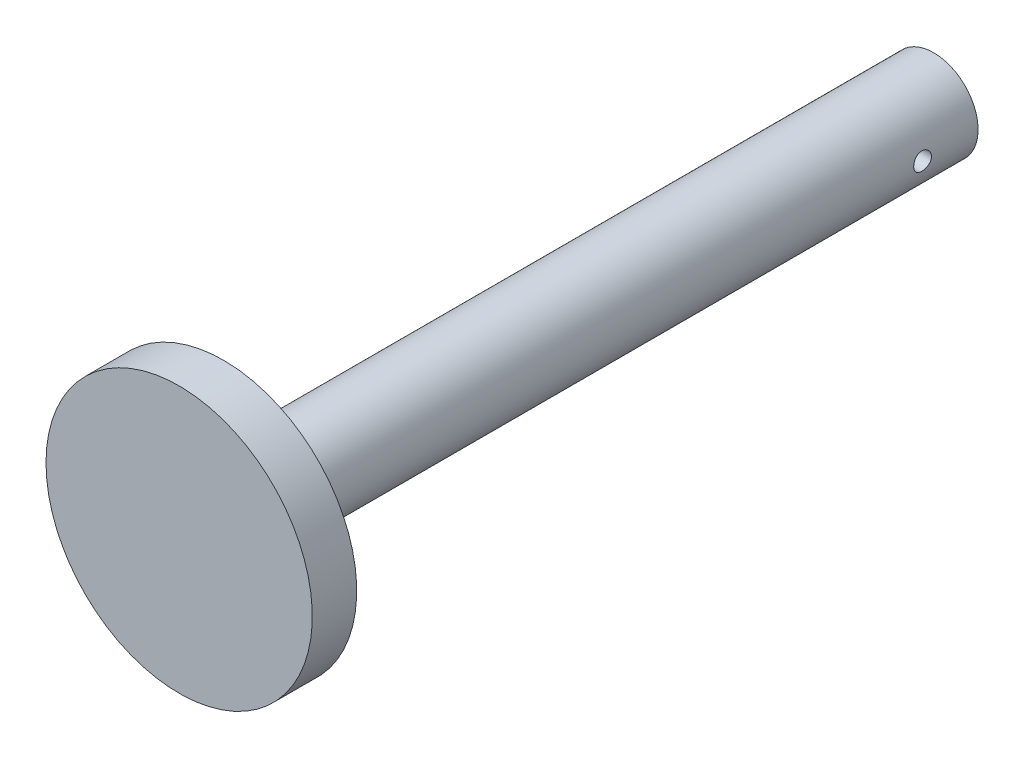
ISO-10303-21;
HEADER;
FILE_DESCRIPTION(('STEP AP214'),'2;1');
FILE_NAME('part.step','',(''),(''),'','','');
FILE_SCHEMA(('AUTOMOTIVE_DESIGN { 1 0 10303 214 1 1 1 1 }'));
ENDSEC;
DATA;
#1=APPLICATION_CONTEXT('core data for automotive mechanical design processes');
#2=APPLICATION_PROTOCOL_DEFINITION('international standard','automotive_design',2000,#1);
#3=PRODUCT_CONTEXT('',#1,'mechanical');
#4=PRODUCT('Part','Part','',(#3));
#5=PRODUCT_RELATED_PRODUCT_CATEGORY('part','',(#4));
#6=PRODUCT_DEFINITION_FORMATION('','',#4);
#7=PRODUCT_DEFINITION_CONTEXT('part definition',#1,'design');
#8=PRODUCT_DEFINITION('design','',#6,#7);
#9=PRODUCT_DEFINITION_SHAPE('','',#8);
#10=(LENGTH_UNIT() NAMED_UNIT(*) SI_UNIT(.MILLI.,.METRE.));
#11=(NAMED_UNIT(*) PLANE_ANGLE_UNIT() SI_UNIT($,.RADIAN.));
#12=(NAMED_UNIT(*) SI_UNIT($,.STERADIAN.) SOLID_ANGLE_UNIT());
#13=UNCERTAINTY_MEASURE_WITH_UNIT(LENGTH_MEASURE(1.E-05),#10,'distance_accuracy_value','');
#14=(GEOMETRIC_REPRESENTATION_CONTEXT(3) GLOBAL_UNCERTAINTY_ASSIGNED_CONTEXT((#13)) GLOBAL_UNIT_ASSIGNED_CONTEXT((#10,
#11,#12)) REPRESENTATION_CONTEXT('',''));
#15=CARTESIAN_POINT('',(0.,0.,0.));
#16=DIRECTION('',(0.,0.,1.));
#17=DIRECTION('',(1.,0.,0.));
#18=AXIS2_PLACEMENT_3D('',#15,#16,#17);
#19=CARTESIAN_POINT('',(0.,0.,0.));
#20=DIRECTION('',(0.,0.,-1.));
#21=DIRECTION('',(-1.,0.,0.));
#22=AXIS2_PLACEMENT_3D('',#19,#20,#21);
#23=PLANE('',#22);
#24=CARTESIAN_POINT('',(0.,0.,0.));
#25=DIRECTION('',(0.,0.,-1.));
#26=DIRECTION('',(-1.,0.,0.));
#27=AXIS2_PLACEMENT_3D('',#24,#25,#26);
#28=CIRCLE('',#27,15.);
#29=CARTESIAN_POINT('',(-15.,0.,0.));
#30=VERTEX_POINT('',#29);
#31=EDGE_CURVE('E10',#30,#30,#28,.T.);
#32=ORIENTED_EDGE('',*,*,#31,.F.);
#33=EDGE_LOOP('',(#32));
#34=FACE_BOUND('',#33,.T.);
#35=ADVANCED_FACE('F37',(#34),#23,.F.);
#36=CARTESIAN_POINT('',(0.,0.,-85.));
#37=DIRECTION('',(0.,0.,-1.));
#38=DIRECTION('',(-1.,0.,0.));
#39=AXIS2_PLACEMENT_3D('',#36,#37,#38);
#40=CYLINDRICAL_SURFACE('',#39,15.);
#41=CARTESIAN_POINT('',(0.,0.,-5.));
#42=DIRECTION('',(0.,0.,-1.));
#43=DIRECTION('',(-1.,0.,0.));
#44=AXIS2_PLACEMENT_3D('',#41,#42,#43);
#45=CIRCLE('',#44,15.);
#46=CARTESIAN_POINT('',(-15.,0.,-5.));
#47=VERTEX_POINT('',#46);
#48=EDGE_CURVE('E49',#47,#47,#45,.T.);
#49=ORIENTED_EDGE('',*,*,#48,.F.);
#50=EDGE_LOOP('',(#49));
#51=FACE_BOUND('',#50,.T.);
#52=ORIENTED_EDGE('',*,*,#31,.T.);
#53=EDGE_LOOP('',(#52));
#54=FACE_BOUND('',#53,.T.);
#55=ADVANCED_FACE('F82',(#51,#54),#40,.T.);
#56=CARTESIAN_POINT('',(0.,-15.,-5.));
#57=DIRECTION('',(0.,0.,1.));
#58=DIRECTION('',(1.,0.,0.));
#59=AXIS2_PLACEMENT_3D('',#56,#57,#58);
#60=PLANE('',#59);
#61=CARTESIAN_POINT('',(0.,0.,-5.));
#62=DIRECTION('',(0.,0.,-1.));
#63=DIRECTION('',(-1.,0.,0.));
#64=AXIS2_PLACEMENT_3D('',#61,#62,#63);
#65=CIRCLE('',#64,5.00000000000001);
#66=CARTESIAN_POINT('',(-5.00000000000001,0.,-5.));
#67=VERTEX_POINT('',#66);
#68=EDGE_CURVE('E54',#67,#67,#65,.T.);
#69=ORIENTED_EDGE('',*,*,#68,.F.);
#70=EDGE_LOOP('',(#69));
#71=FACE_BOUND('',#70,.T.);
#72=ORIENTED_EDGE('',*,*,#48,.T.);
#73=EDGE_LOOP('',(#72));
#74=FACE_BOUND('',#73,.T.);
#75=ADVANCED_FACE('F78',(#71,#74),#60,.F.);
#76=CARTESIAN_POINT('',(0.,0.,-85.));
#77=DIRECTION('',(0.,0.,-1.));
#78=DIRECTION('',(-1.,0.,0.));
#79=AXIS2_PLACEMENT_3D('',#76,#77,#78);
#80=CYLINDRICAL_SURFACE('',#79,5.00000000000001);
#81=CARTESIAN_POINT('',(-5.00000000000001,0.,-77.75));
#82=CARTESIAN_POINT('',(-4.99999897580872,-0.0555769067926333,-77.7500020444983));
#83=CARTESIAN_POINT('',(-4.99906385178232,-0.111179660201522,-77.7546488429677));
#84=CARTESIAN_POINT('',(-4.99542365623232,-0.220813507689019,-77.7730985001153));
#85=CARTESIAN_POINT('',(-4.99271717860187,-0.274843317541355,-77.7869086328015));
#86=CARTESIAN_POINT('',(-4.98583649278288,-0.379730305263311,-77.8232412736208));
#87=CARTESIAN_POINT('',(-4.98166369076719,-0.430590467933132,-77.8457554368447));
#88=CARTESIAN_POINT('',(-4.97230398035315,-0.527807988864222,-77.8988322475113));
#89=CARTESIAN_POINT('',(-4.96711713235708,-0.574165615075807,-77.9293944156072));
#90=CARTESIAN_POINT('',(-4.95622165329971,-0.661693477314862,-77.9981384942914));
#91=CARTESIAN_POINT('',(-4.95050745504348,-0.702793951158523,-78.0364083553912));
#92=CARTESIAN_POINT('',(-4.93924180452589,-0.778036756608029,-78.1192924163917));
#93=CARTESIAN_POINT('',(-4.93369036500425,-0.812178544770425,-78.1639071113351));
#94=CARTESIAN_POINT('',(-4.92332441812616,-0.872831753347618,-78.2587161930119));
#95=CARTESIAN_POINT('',(-4.91851707364947,-0.899270938865864,-78.3089576437963));
#96=CARTESIAN_POINT('',(-4.91026268058419,-0.943305666580306,-78.4132818190041));
#97=CARTESIAN_POINT('',(-4.90681549761963,-0.960902082437236,-78.4673641633463));
#98=CARTESIAN_POINT('',(-4.90172805252206,-0.986525299884824,-78.5770843639079));
#99=CARTESIAN_POINT('',(-4.90006470107189,-0.994674497958774,-78.6326925441422));
#100=CARTESIAN_POINT('',(-4.89866375060628,-1.00155212772612,-78.7445098213643));
#101=CARTESIAN_POINT('',(-4.89892595467842,-1.0002815227135,-78.8007188563201));
#102=CARTESIAN_POINT('',(-4.90132551148186,-0.988454573101819,-78.911246788021));
#103=CARTESIAN_POINT('',(-4.90343452858764,-0.978038540243907,-78.9655814056273));
#104=CARTESIAN_POINT('',(-4.90924546160002,-0.948437884623052,-79.071716076663));
#105=CARTESIAN_POINT('',(-4.9129474535778,-0.929252843100683,-79.123516008919));
#106=CARTESIAN_POINT('',(-4.92155618500409,-0.88252478367472,-79.2235152617036));
#107=CARTESIAN_POINT('',(-4.92647089813705,-0.854926151232111,-79.2716878795692));
#108=CARTESIAN_POINT('',(-4.93694618773063,-0.792193574572674,-79.3627708499728));
#109=CARTESIAN_POINT('',(-4.94250683838367,-0.757058764356825,-79.4056805968512));
#110=CARTESIAN_POINT('',(-4.95377021241463,-0.67949993456058,-79.4858294024569));
#111=CARTESIAN_POINT('',(-4.95947369210906,-0.636956161212439,-79.5229525678591));
#112=CARTESIAN_POINT('',(-4.97028848714409,-0.546185024062006,-79.5895538463012));
#113=CARTESIAN_POINT('',(-4.97539979488975,-0.497957587379388,-79.6190318612936));
#114=CARTESIAN_POINT('',(-4.98446690160888,-0.397059386878923,-79.669527509226));
#115=CARTESIAN_POINT('',(-4.98842088848273,-0.344381819585303,-79.6905318936445));
#116=CARTESIAN_POINT('',(-4.99471408987859,-0.236148976448668,-79.7233604740386));
#117=CARTESIAN_POINT('',(-4.99705350000532,-0.180594050072452,-79.7351857820736));
#118=CARTESIAN_POINT('',(-4.99982671866869,-0.0691794056271522,-79.7491564537943));
#119=CARTESIAN_POINT('',(-5.00029174652471,-0.0133403283255786,-79.7514604195403));
#120=CARTESIAN_POINT('',(-4.99935051930104,0.0979249341927108,-79.7467501410578));
#121=CARTESIAN_POINT('',(-4.99794436941447,0.15335114244379,-79.7397364206474));
#122=CARTESIAN_POINT('',(-4.99343832008019,0.261705659946538,-79.716721626456));
#123=CARTESIAN_POINT('',(-4.99035376404207,0.314651948339902,-79.7008019315021));
#124=CARTESIAN_POINT('',(-4.98283552061034,0.417123627499666,-79.6605160173442));
#125=CARTESIAN_POINT('',(-4.97840173214228,0.466648761637537,-79.6361491653232));
#126=CARTESIAN_POINT('',(-4.96859911533295,0.561541173686216,-79.5793175093487));
#127=CARTESIAN_POINT('',(-4.96321950437053,0.606850126752188,-79.546757218961));
#128=CARTESIAN_POINT('',(-4.95214734829883,0.691418019119205,-79.4745908087927));
#129=CARTESIAN_POINT('',(-4.94645476968389,0.730676308930757,-79.4349839336001));
#130=CARTESIAN_POINT('',(-4.93529303556966,0.802640590774168,-79.3491266481089));
#131=CARTESIAN_POINT('',(-4.92982860233305,0.835237702448649,-79.3027842557787));
#132=CARTESIAN_POINT('',(-4.91984191796195,0.892185420051201,-79.2051886386433));
#133=CARTESIAN_POINT('',(-4.91531962913344,0.9165363559229,-79.1539356104265));
#134=CARTESIAN_POINT('',(-4.90776740584384,0.956151841581957,-79.0482317538505));
#135=CARTESIAN_POINT('',(-4.90472974872188,0.971463499791047,-78.9937991587897));
#136=CARTESIAN_POINT('',(-4.90047436792026,0.992708651627194,-78.8830665465091));
#137=CARTESIAN_POINT('',(-4.89925640691112,0.99864336822511,-78.8267667737907));
#138=CARTESIAN_POINT('',(-4.8987914963138,1.00092091086747,-78.7149911354557));
#139=CARTESIAN_POINT('',(-4.89950919189302,0.997435788070894,-78.659518851073));
#140=CARTESIAN_POINT('',(-4.90275573484615,0.981352304100057,-78.549968350095));
#141=CARTESIAN_POINT('',(-4.9052845676717,0.968754016129295,-78.4958901223052));
#142=CARTESIAN_POINT('',(-4.9118526421916,0.934878568498949,-78.3907722887595));
#143=CARTESIAN_POINT('',(-4.91588821018832,0.913622506717336,-78.3397256394976));
#144=CARTESIAN_POINT('',(-4.92501714974171,0.863054644601594,-78.2418962792655));
#145=CARTESIAN_POINT('',(-4.93011060998895,0.833742168774874,-78.1951139262748));
#146=CARTESIAN_POINT('',(-4.94088960523226,0.767305914786405,-78.1062844278497));
#147=CARTESIAN_POINT('',(-4.94658372909701,0.730057887235169,-78.0643312347324));
#148=CARTESIAN_POINT('',(-4.95786081871956,0.649064369013129,-77.9872137944708));
#149=CARTESIAN_POINT('',(-4.96344375863186,0.605317387153327,-77.9520511096827));
#150=CARTESIAN_POINT('',(-4.97393832387973,0.512017629088244,-77.8891653560535));
#151=CARTESIAN_POINT('',(-4.97884231219247,0.462408884429834,-77.86152399672));
#152=CARTESIAN_POINT('',(-4.98735125085001,0.359166360940733,-77.8150138774034));
#153=CARTESIAN_POINT('',(-4.99095737138617,0.305536260863127,-77.7961372104675));
#154=CARTESIAN_POINT('',(-4.99576372595372,0.209821488923781,-77.7713480519553));
#155=CARTESIAN_POINT('',(-4.99734303158453,0.168281664013787,-77.7633568062923));
#156=CARTESIAN_POINT('',(-4.99946154139894,0.0844995252100685,-77.7526820876416));
#157=CARTESIAN_POINT('',(-5.00000077873156,0.0422572337486197,-77.7499984454902));
#158=CARTESIAN_POINT('',(-5.00000000000001,0.,-77.75));
#159=B_SPLINE_CURVE_WITH_KNOTS('',3,(#81,#82,#83,#84,#85,#86,#87,#88,#89,#90,#91,#92,#93,#94,
#95,#96,#97,#98,#99,#100,#101,#102,#103,#104,#105,#106,#107,#108,#109,#110,#111,#112,#113,#114,
#115,#116,#117,#118,#119,#120,#121,#122,#123,#124,#125,#126,#127,#128,#129,#130,#131,#132,#133,
#134,#135,#136,#137,#138,#139,#140,#141,#142,#143,#144,#145,#146,#147,#148,#149,#150,#151,#152,
#153,#154,#155,#156,#157,#158),.UNSPECIFIED.,.T.,.F.,(4,2,2,2,2,2,2,2,2,2,2,2,2,2,2,2,2,2,2,2,2,
2,2,2,2,2,2,2,2,2,2,2,2,2,2,2,2,2,4),(0.,0.16657613066126,0.333284650691321,0.499833735250335,
0.666372902230861,0.834932670112188,1.00350559674737,1.17361195005921,1.34370149365197,
1.51156185103587,1.67940504281224,1.84471727006277,2.01003739253728,2.17647490203593,
2.34293154749671,2.5123825249135,2.68183567539819,2.85155274854023,3.02124925698035,
3.18810735676264,3.35495607657866,3.52030453950722,3.68566539216022,3.85305066033358,
4.02045388345928,4.19040628579224,4.36035188723465,4.5294038103272,4.69843368330414,
4.86439722567702,5.03035943492608,5.1959196125311,5.36149367581867,5.52988076239143,
5.6983065453293,5.86849496675636,6.03852955517517,6.16518775289892,6.29184191370995),.UNSPECIFIED.);
#160=CARTESIAN_POINT('',(-5.00000000000001,0.,-77.75));
#161=VERTEX_POINT('',#160);
#162=EDGE_CURVE('E40',#161,#161,#159,.T.);
#163=ORIENTED_EDGE('',*,*,#162,.T.);
#164=EDGE_LOOP('',(#163));
#165=FACE_BOUND('',#164,.T.);
#166=CARTESIAN_POINT('',(5.00000000000001,0.,-79.75));
#167=CARTESIAN_POINT('',(4.99999897580872,-0.0555769067926332,-79.7499979555017));
#168=CARTESIAN_POINT('',(4.99906385178232,-0.111179660201522,-79.7453511570323));
#169=CARTESIAN_POINT('',(4.99542365623232,-0.220813507689019,-79.7269014998847));
#170=CARTESIAN_POINT('',(4.99271717860187,-0.274843317541356,-79.7130913671985));
#171=CARTESIAN_POINT('',(4.98583649278288,-0.379730305263316,-79.6767587263792));
#172=CARTESIAN_POINT('',(4.98166369076719,-0.430590467933139,-79.6542445631553));
#173=CARTESIAN_POINT('',(4.97230398035315,-0.527807988864228,-79.6011677524887));
#174=CARTESIAN_POINT('',(4.96711713235708,-0.57416561507581,-79.5706055843928));
#175=CARTESIAN_POINT('',(4.95622165329971,-0.661693477314859,-79.5018615057086));
#176=CARTESIAN_POINT('',(4.95050745504348,-0.70279395115852,-79.4635916446088));
#177=CARTESIAN_POINT('',(4.93924180452589,-0.778036756608026,-79.3807075836083));
#178=CARTESIAN_POINT('',(4.93369036500425,-0.812178544770423,-79.3360928886649));
#179=CARTESIAN_POINT('',(4.92332441812616,-0.872831753347618,-79.2412838069881));
#180=CARTESIAN_POINT('',(4.91851707364947,-0.899270938865864,-79.1910423562037));
#181=CARTESIAN_POINT('',(4.91026268058419,-0.943305666580306,-79.0867181809959));
#182=CARTESIAN_POINT('',(4.90681549761963,-0.960902082437236,-79.0326358366537));
#183=CARTESIAN_POINT('',(4.90172805252206,-0.986525299884824,-78.9229156360921));
#184=CARTESIAN_POINT('',(4.90006470107189,-0.994674497958774,-78.8673074558578));
#185=CARTESIAN_POINT('',(4.89866375060628,-1.00155212772612,-78.7554901786357));
#186=CARTESIAN_POINT('',(4.89892595467842,-1.0002815227135,-78.6992811436799));
#187=CARTESIAN_POINT('',(4.90132551148186,-0.988454573101819,-78.588753211979));
#188=CARTESIAN_POINT('',(4.90343452858764,-0.978038540243907,-78.5344185943727));
#189=CARTESIAN_POINT('',(4.90924546160002,-0.948437884623052,-78.428283923337));
#190=CARTESIAN_POINT('',(4.9129474535778,-0.929252843100683,-78.376483991081));
#191=CARTESIAN_POINT('',(4.92155618500409,-0.882524783674721,-78.2764847382964));
#192=CARTESIAN_POINT('',(4.92647089813705,-0.854926151232114,-78.2283121204308));
#193=CARTESIAN_POINT('',(4.93694618773063,-0.792193574572678,-78.1372291500272));
#194=CARTESIAN_POINT('',(4.94250683838367,-0.757058764356828,-78.0943194031488));
#195=CARTESIAN_POINT('',(4.95377021241463,-0.67949993456058,-78.0141705975431));
#196=CARTESIAN_POINT('',(4.95947369210906,-0.63695616121244,-77.9770474321409));
#197=CARTESIAN_POINT('',(4.97028848714409,-0.546185024062006,-77.9104461536988));
#198=CARTESIAN_POINT('',(4.97539979488975,-0.497957587379388,-77.8809681387064));
#199=CARTESIAN_POINT('',(4.98446690160888,-0.397059386878923,-77.830472490774));
#200=CARTESIAN_POINT('',(4.98842088848273,-0.344381819585303,-77.8094681063555));
#201=CARTESIAN_POINT('',(4.99471408987859,-0.236148976448668,-77.7766395259614));
#202=CARTESIAN_POINT('',(4.99705350000532,-0.180594050072452,-77.7648142179264));
#203=CARTESIAN_POINT('',(4.99982671866869,-0.0691794056271522,-77.7508435462057));
#204=CARTESIAN_POINT('',(5.00029174652471,-0.0133403283255786,-77.7485395804597));
#205=CARTESIAN_POINT('',(4.99935051930104,0.0979249341927108,-77.7532498589422));
#206=CARTESIAN_POINT('',(4.99794436941447,0.15335114244379,-77.7602635793526));
#207=CARTESIAN_POINT('',(4.99343832008019,0.261705659946538,-77.783278373544));
#208=CARTESIAN_POINT('',(4.99035376404207,0.314651948339902,-77.7991980684979));
#209=CARTESIAN_POINT('',(4.98283552061034,0.417123627499666,-77.8394839826558));
#210=CARTESIAN_POINT('',(4.97840173214228,0.466648761637537,-77.8638508346768));
#211=CARTESIAN_POINT('',(4.96859911533295,0.561541173686216,-77.9206824906513));
#212=CARTESIAN_POINT('',(4.96321950437053,0.606850126752188,-77.953242781039));
#213=CARTESIAN_POINT('',(4.95214734829883,0.691418019119205,-78.0254091912073));
#214=CARTESIAN_POINT('',(4.94645476968389,0.730676308930757,-78.0650160663999));
#215=CARTESIAN_POINT('',(4.93529303556966,0.802640590774168,-78.1508733518911));
#216=CARTESIAN_POINT('',(4.92982860233305,0.835237702448649,-78.1972157442213));
#217=CARTESIAN_POINT('',(4.91984191796195,0.892185420051201,-78.2948113613567));
#218=CARTESIAN_POINT('',(4.91531962913344,0.9165363559229,-78.3460643895735));
#219=CARTESIAN_POINT('',(4.90776740584384,0.956151841581957,-78.4517682461495));
#220=CARTESIAN_POINT('',(4.90472974872188,0.971463499791047,-78.5062008412103));
#221=CARTESIAN_POINT('',(4.90047436792026,0.992708651627194,-78.6169334534909));
#222=CARTESIAN_POINT('',(4.89925640691112,0.99864336822511,-78.6732332262093));
#223=CARTESIAN_POINT('',(4.8987914963138,1.00092091086747,-78.7850088645443));
#224=CARTESIAN_POINT('',(4.89950919189302,0.997435788070894,-78.840481148927));
#225=CARTESIAN_POINT('',(4.90275573484615,0.981352304100057,-78.950031649905));
#226=CARTESIAN_POINT('',(4.9052845676717,0.968754016129295,-79.0041098776948));
#227=CARTESIAN_POINT('',(4.9118526421916,0.934878568498949,-79.1092277112405));
#228=CARTESIAN_POINT('',(4.91588821018832,0.913622506717336,-79.1602743605024));
#229=CARTESIAN_POINT('',(4.92501714974171,0.863054644601594,-79.2581037207345));
#230=CARTESIAN_POINT('',(4.93011060998895,0.833742168774875,-79.3048860737252));
#231=CARTESIAN_POINT('',(4.94088960523226,0.767305914786407,-79.3937155721503));
#232=CARTESIAN_POINT('',(4.94658372909701,0.730057887235172,-79.4356687652676));
#233=CARTESIAN_POINT('',(4.95786081871956,0.649064369013133,-79.5127862055292));
#234=CARTESIAN_POINT('',(4.96344375863185,0.60531738715333,-79.5479488903173));
#235=CARTESIAN_POINT('',(4.97393832387972,0.512017629088245,-79.6108346439465));
#236=CARTESIAN_POINT('',(4.97884231219247,0.462408884429834,-79.63847600328));
#237=CARTESIAN_POINT('',(4.98735125085001,0.359166360940733,-79.6849861225966));
#238=CARTESIAN_POINT('',(4.99095737138617,0.305536260863127,-79.7038627895325));
#239=CARTESIAN_POINT('',(4.99576372595372,0.20982148892378,-79.7286519480447));
#240=CARTESIAN_POINT('',(4.99734303158453,0.168281664013785,-79.7366431937077));
#241=CARTESIAN_POINT('',(4.99946154139894,0.0844995252100673,-79.7473179123584));
#242=CARTESIAN_POINT('',(5.00000077873156,0.0422572337486191,-79.7500015545098));
#243=CARTESIAN_POINT('',(5.00000000000001,0.,-79.75));
#244=B_SPLINE_CURVE_WITH_KNOTS('',3,(#166,#167,#168,#169,#170,#171,#172,#173,#174,#175,#176,
#177,#178,#179,#180,#181,#182,#183,#184,#185,#186,#187,#188,#189,#190,#191,#192,#193,#194,#195,
#196,#197,#198,#199,#200,#201,#202,#203,#204,#205,#206,#207,#208,#209,#210,#211,#212,#213,#214,
#215,#216,#217,#218,#219,#220,#221,#222,#223,#224,#225,#226,#227,#228,#229,#230,#231,#232,#233,
#234,#235,#236,#237,#238,#239,#240,#241,#242,#243),.UNSPECIFIED.,.T.,.F.,(4,2,2,2,2,2,2,2,2,2,2,
2,2,2,2,2,2,2,2,2,2,2,2,2,2,2,2,2,2,2,2,2,2,2,2,2,2,2,4),(0.,0.16657613066126,0.333284650691321,
0.499833735250351,0.66637290223086,0.834932670112172,1.00350559674737,1.17361195005921,
1.34370149365197,1.51156185103587,1.67940504281224,1.84471727006277,2.01003739253728,
2.17647490203591,2.34293154749671,2.5123825249135,2.68183567539819,2.85155274854023,
3.02124925698035,3.18810735676264,3.35495607657866,3.52030453950722,3.68566539216022,
3.85305066033358,4.02045388345928,4.19040628579224,4.36035188723465,4.5294038103272,
4.69843368330414,4.86439722567702,5.03035943492608,5.1959196125311,5.36149367581867,
5.52988076239142,5.6983065453293,5.86849496675636,6.03852955517517,6.16518775289892,
6.29184191370994),.UNSPECIFIED.);
#245=CARTESIAN_POINT('',(5.00000000000001,0.,-79.75));
#246=VERTEX_POINT('',#245);
#247=EDGE_CURVE('E57',#246,#246,#244,.T.);
#248=ORIENTED_EDGE('',*,*,#247,.T.);
#249=EDGE_LOOP('',(#248));
#250=FACE_BOUND('',#249,.T.);
#251=CARTESIAN_POINT('',(0.,0.,-85.));
#252=DIRECTION('',(0.,0.,-1.));
#253=DIRECTION('',(-1.,0.,0.));
#254=AXIS2_PLACEMENT_3D('',#251,#252,#253);
#255=CIRCLE('',#254,5.00000000000001);
#256=CARTESIAN_POINT('',(-5.00000000000001,0.,-85.));
#257=VERTEX_POINT('',#256);
#258=EDGE_CURVE('E98',#257,#257,#255,.T.);
#259=ORIENTED_EDGE('',*,*,#258,.F.);
#260=EDGE_LOOP('',(#259));
#261=FACE_BOUND('',#260,.T.);
#262=ORIENTED_EDGE('',*,*,#68,.T.);
#263=EDGE_LOOP('',(#262));
#264=FACE_BOUND('',#263,.T.);
#265=ADVANCED_FACE('F62',(#165,#250,#261,#264),#80,.T.);
#266=CARTESIAN_POINT('',(0.,-5.00000000000001,-85.));
#267=DIRECTION('',(0.,0.,1.));
#268=DIRECTION('',(1.,0.,0.));
#269=AXIS2_PLACEMENT_3D('',#266,#267,#268);
#270=PLANE('',#269);
#271=ORIENTED_EDGE('',*,*,#258,.T.);
#272=EDGE_LOOP('',(#271));
#273=FACE_BOUND('',#272,.T.);
#274=ADVANCED_FACE('F69',(#273),#270,.F.);
#275=CARTESIAN_POINT('',(-15.,0.,-78.75));
#276=DIRECTION('',(1.,0.,0.));
#277=DIRECTION('',(0.,0.,-1.));
#278=AXIS2_PLACEMENT_3D('',#275,#276,#277);
#279=CYLINDRICAL_SURFACE('',#278,0.999999999999998);
#280=ORIENTED_EDGE('',*,*,#247,.F.);
#281=EDGE_LOOP('',(#280));
#282=FACE_BOUND('',#281,.T.);
#283=ORIENTED_EDGE('',*,*,#162,.F.);
#284=EDGE_LOOP('',(#283));
#285=FACE_BOUND('',#284,.T.);
#286=ADVANCED_FACE('F66',(#282,#285),#279,.F.);
#287=CLOSED_SHELL('',(#35,#55,#75,#265,#274,#286));
#288=MANIFOLD_SOLID_BREP('B2',#287);
#289=ADVANCED_BREP_SHAPE_REPRESENTATION('',(#18,#288),#14);
#290=SHAPE_DEFINITION_REPRESENTATION(#9,#289);
ENDSEC;
END-ISO-10303-21;
